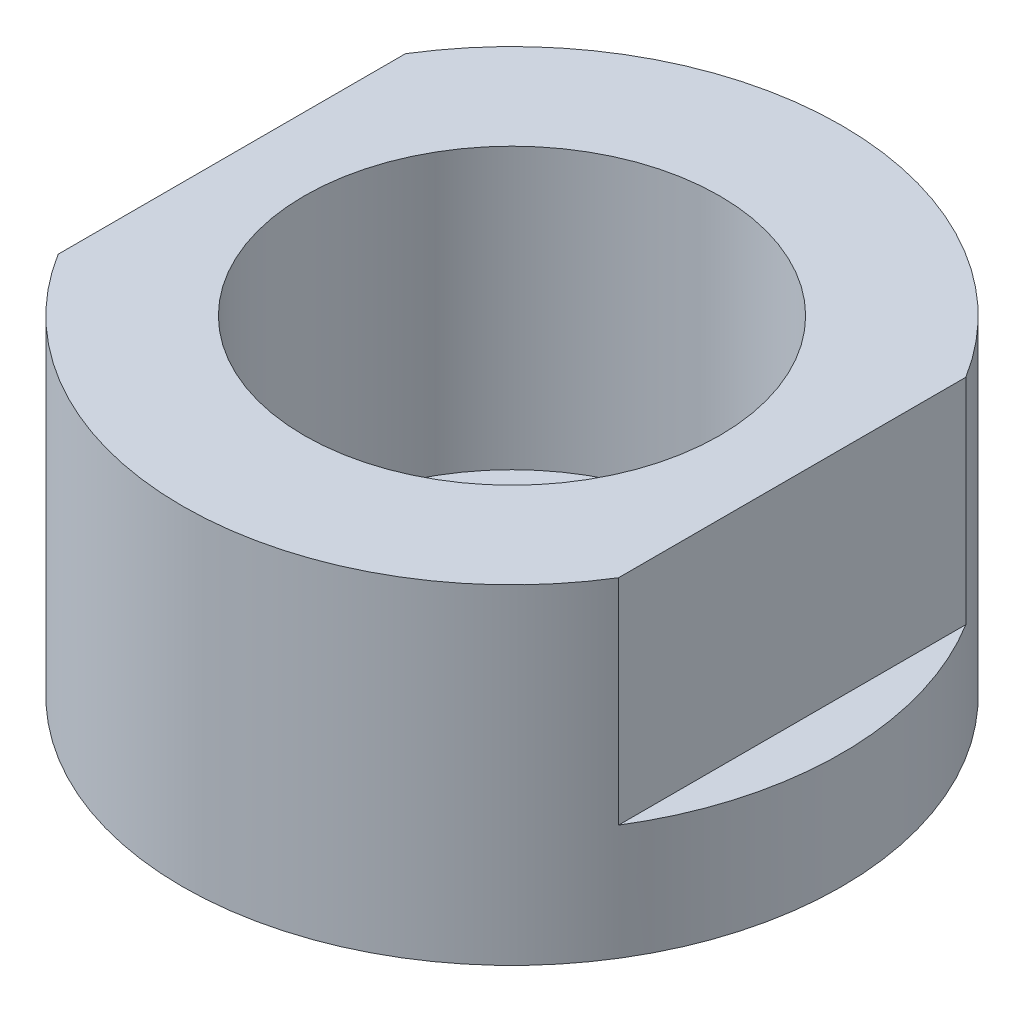
ISO-10303-21;
HEADER;
FILE_DESCRIPTION(('STEP AP214'),'2;1');
FILE_NAME('part.step','',(''),(''),'','','');
FILE_SCHEMA(('AUTOMOTIVE_DESIGN { 1 0 10303 214 1 1 1 1 }'));
ENDSEC;
DATA;
#1=APPLICATION_CONTEXT('core data for automotive mechanical design processes');
#2=APPLICATION_PROTOCOL_DEFINITION('international standard','automotive_design',2000,#1);
#3=PRODUCT_CONTEXT('',#1,'mechanical');
#4=PRODUCT('Part','Part','',(#3));
#5=PRODUCT_RELATED_PRODUCT_CATEGORY('part','',(#4));
#6=PRODUCT_DEFINITION_FORMATION('','',#4);
#7=PRODUCT_DEFINITION_CONTEXT('part definition',#1,'design');
#8=PRODUCT_DEFINITION('design','',#6,#7);
#9=PRODUCT_DEFINITION_SHAPE('','',#8);
#10=(LENGTH_UNIT() NAMED_UNIT(*) SI_UNIT(.MILLI.,.METRE.));
#11=(NAMED_UNIT(*) PLANE_ANGLE_UNIT() SI_UNIT($,.RADIAN.));
#12=(NAMED_UNIT(*) SI_UNIT($,.STERADIAN.) SOLID_ANGLE_UNIT());
#13=UNCERTAINTY_MEASURE_WITH_UNIT(LENGTH_MEASURE(1.E-05),#10,'distance_accuracy_value','');
#14=(GEOMETRIC_REPRESENTATION_CONTEXT(3) GLOBAL_UNCERTAINTY_ASSIGNED_CONTEXT((#13)) GLOBAL_UNIT_ASSIGNED_CONTEXT((#10,
#11,#12)) REPRESENTATION_CONTEXT('',''));
#15=CARTESIAN_POINT('',(0.,0.,0.));
#16=DIRECTION('',(0.,0.,1.));
#17=DIRECTION('',(1.,0.,0.));
#18=AXIS2_PLACEMENT_3D('',#15,#16,#17);
#19=CARTESIAN_POINT('',(0.,25.4,0.));
#20=DIRECTION('',(0.,-1.,0.));
#21=DIRECTION('',(0.,0.,-1.));
#22=AXIS2_PLACEMENT_3D('',#19,#20,#21);
#23=CYLINDRICAL_SURFACE('',#22,25.4);
#24=CARTESIAN_POINT('',(0.,0.,0.));
#25=DIRECTION('',(0.,1.,0.));
#26=DIRECTION('',(0.,0.,1.));
#27=AXIS2_PLACEMENT_3D('',#24,#25,#26);
#28=CIRCLE('',#27,25.4);
#29=CARTESIAN_POINT('',(0.,0.,25.4));
#30=VERTEX_POINT('',#29);
#31=EDGE_CURVE('E48',#30,#30,#28,.T.);
#32=ORIENTED_EDGE('',*,*,#31,.T.);
#33=EDGE_LOOP('',(#32));
#34=FACE_BOUND('',#33,.T.);
#35=DIRECTION('',(0.,-1.,0.));
#36=VECTOR('',#35,1.);
#37=CARTESIAN_POINT('',(21.59,25.4,13.380280266123));
#38=LINE('',#37,#36);
#39=CARTESIAN_POINT('',(21.59,8.89,13.380280266123));
#40=VERTEX_POINT('',#39);
#41=CARTESIAN_POINT('',(21.59,25.4,13.380280266123));
#42=VERTEX_POINT('',#41);
#43=EDGE_CURVE('E96',#40,#42,#38,.F.);
#44=ORIENTED_EDGE('',*,*,#43,.T.);
#45=CARTESIAN_POINT('',(0.,25.4,0.));
#46=DIRECTION('',(0.,1.,0.));
#47=DIRECTION('',(0.,0.,1.));
#48=AXIS2_PLACEMENT_3D('',#45,#46,#47);
#49=CIRCLE('',#48,25.4);
#50=CARTESIAN_POINT('',(-21.59,25.4,13.380280266123));
#51=VERTEX_POINT('',#50);
#52=EDGE_CURVE('E53',#51,#42,#49,.T.);
#53=ORIENTED_EDGE('',*,*,#52,.F.);
#54=DIRECTION('',(0.,-1.,0.));
#55=VECTOR('',#54,1.);
#56=CARTESIAN_POINT('',(-21.59,25.4,13.380280266123));
#57=LINE('',#56,#55);
#58=CARTESIAN_POINT('',(-21.59,8.89,13.380280266123));
#59=VERTEX_POINT('',#58);
#60=EDGE_CURVE('E62',#51,#59,#57,.T.);
#61=ORIENTED_EDGE('',*,*,#60,.T.);
#62=CARTESIAN_POINT('',(0.,8.89,0.));
#63=DIRECTION('',(0.,1.,0.));
#64=DIRECTION('',(0.,0.,1.));
#65=AXIS2_PLACEMENT_3D('',#62,#63,#64);
#66=CIRCLE('',#65,25.4);
#67=CARTESIAN_POINT('',(-21.59,8.89,-13.380280266123));
#68=VERTEX_POINT('',#67);
#69=EDGE_CURVE('E120',#59,#68,#66,.F.);
#70=ORIENTED_EDGE('',*,*,#69,.T.);
#71=DIRECTION('',(0.,-1.,0.));
#72=VECTOR('',#71,1.);
#73=CARTESIAN_POINT('',(-21.59,25.4,-13.380280266123));
#74=LINE('',#73,#72);
#75=CARTESIAN_POINT('',(-21.59,25.4,-13.380280266123));
#76=VERTEX_POINT('',#75);
#77=EDGE_CURVE('E117',#76,#68,#74,.T.);
#78=ORIENTED_EDGE('',*,*,#77,.F.);
#79=CARTESIAN_POINT('',(21.59,25.4,-13.380280266123));
#80=VERTEX_POINT('',#79);
#81=EDGE_CURVE('E12',#80,#76,#49,.T.);
#82=ORIENTED_EDGE('',*,*,#81,.F.);
#83=DIRECTION('',(0.,-1.,0.));
#84=VECTOR('',#83,1.);
#85=CARTESIAN_POINT('',(21.59,25.4,-13.380280266123));
#86=LINE('',#85,#84);
#87=CARTESIAN_POINT('',(21.59,8.89,-13.380280266123));
#88=VERTEX_POINT('',#87);
#89=EDGE_CURVE('E70',#88,#80,#86,.F.);
#90=ORIENTED_EDGE('',*,*,#89,.F.);
#91=CARTESIAN_POINT('',(0.,8.89,0.));
#92=DIRECTION('',(0.,1.,0.));
#93=DIRECTION('',(0.,0.,1.));
#94=AXIS2_PLACEMENT_3D('',#91,#92,#93);
#95=CIRCLE('',#94,25.4);
#96=EDGE_CURVE('E89',#88,#40,#95,.F.);
#97=ORIENTED_EDGE('',*,*,#96,.T.);
#98=EDGE_LOOP('',(#44,#53,#61,#70,#78,#82,#90,#97));
#99=FACE_BOUND('',#98,.T.);
#100=ADVANCED_FACE('F45',(#34,#99),#23,.T.);
#101=CARTESIAN_POINT('',(0.,25.4,0.));
#102=DIRECTION('',(0.,1.,0.));
#103=DIRECTION('',(0.,0.,1.));
#104=AXIS2_PLACEMENT_3D('',#101,#102,#103);
#105=PLANE('',#104);
#106=CARTESIAN_POINT('',(0.,25.4,0.));
#107=DIRECTION('',(0.,1.,0.));
#108=DIRECTION('',(0.,0.,1.));
#109=AXIS2_PLACEMENT_3D('',#106,#107,#108);
#110=CIRCLE('',#109,16.);
#111=CARTESIAN_POINT('',(0.,25.4,16.));
#112=VERTEX_POINT('',#111);
#113=EDGE_CURVE('E116',#112,#112,#110,.T.);
#114=ORIENTED_EDGE('',*,*,#113,.F.);
#115=EDGE_LOOP('',(#114));
#116=FACE_BOUND('',#115,.T.);
#117=ORIENTED_EDGE('',*,*,#52,.T.);
#118=DIRECTION('',(0.,0.,-1.));
#119=VECTOR('',#118,1.);
#120=CARTESIAN_POINT('',(21.59,25.4,25.401));
#121=LINE('',#120,#119);
#122=EDGE_CURVE('E100',#42,#80,#121,.T.);
#123=ORIENTED_EDGE('',*,*,#122,.T.);
#124=ORIENTED_EDGE('',*,*,#81,.T.);
#125=DIRECTION('',(0.,0.,-1.));
#126=VECTOR('',#125,1.);
#127=CARTESIAN_POINT('',(-21.59,25.4,25.401));
#128=LINE('',#127,#126);
#129=EDGE_CURVE('E107',#51,#76,#128,.T.);
#130=ORIENTED_EDGE('',*,*,#129,.F.);
#131=EDGE_LOOP('',(#117,#123,#124,#130));
#132=FACE_BOUND('',#131,.T.);
#133=ADVANCED_FACE('F148',(#116,#132),#105,.T.);
#134=CARTESIAN_POINT('',(0.,0.,0.));
#135=DIRECTION('',(0.,1.,0.));
#136=DIRECTION('',(0.,0.,1.));
#137=AXIS2_PLACEMENT_3D('',#134,#135,#136);
#138=PLANE('',#137);
#139=CARTESIAN_POINT('',(0.,0.,-8.89));
#140=DIRECTION('',(0.,1.,0.));
#141=DIRECTION('',(0.,0.,1.));
#142=AXIS2_PLACEMENT_3D('',#139,#140,#141);
#143=CIRCLE('',#142,1.);
#144=CARTESIAN_POINT('',(0.,0.,-7.89));
#145=VERTEX_POINT('',#144);
#146=EDGE_CURVE('E121',#145,#145,#143,.F.);
#147=ORIENTED_EDGE('',*,*,#146,.F.);
#148=EDGE_LOOP('',(#147));
#149=FACE_BOUND('',#148,.T.);
#150=CARTESIAN_POINT('',(7.6989658396442,0.,4.44499999999969));
#151=DIRECTION('',(0.,1.,0.));
#152=DIRECTION('',(0.,0.,1.));
#153=AXIS2_PLACEMENT_3D('',#150,#151,#152);
#154=CIRCLE('',#153,1.);
#155=CARTESIAN_POINT('',(7.6989658396442,0.,5.44499999999969));
#156=VERTEX_POINT('',#155);
#157=EDGE_CURVE('E260',#156,#156,#154,.F.);
#158=ORIENTED_EDGE('',*,*,#157,.F.);
#159=EDGE_LOOP('',(#158));
#160=FACE_BOUND('',#159,.T.);
#161=CARTESIAN_POINT('',(-7.69896583964312,0.,4.44500000000031));
#162=DIRECTION('',(0.,1.,0.));
#163=DIRECTION('',(0.,0.,1.));
#164=AXIS2_PLACEMENT_3D('',#161,#162,#163);
#165=CIRCLE('',#164,1.);
#166=CARTESIAN_POINT('',(-7.69896583964312,0.,5.44500000000031));
#167=VERTEX_POINT('',#166);
#168=EDGE_CURVE('E110',#167,#167,#165,.F.);
#169=ORIENTED_EDGE('',*,*,#168,.F.);
#170=EDGE_LOOP('',(#169));
#171=FACE_BOUND('',#170,.T.);
#172=ORIENTED_EDGE('',*,*,#31,.F.);
#173=EDGE_LOOP('',(#172));
#174=FACE_BOUND('',#173,.T.);
#175=ADVANCED_FACE('F145',(#149,#160,#171,#174),#138,.F.);
#176=CARTESIAN_POINT('',(0.,-45.254833995939,0.));
#177=DIRECTION('',(0.,1.,0.));
#178=DIRECTION('',(0.,0.,1.));
#179=AXIS2_PLACEMENT_3D('',#176,#177,#178);
#180=CYLINDRICAL_SURFACE('',#179,16.);
#181=CARTESIAN_POINT('',(0.,3.81,0.));
#182=DIRECTION('',(0.,1.,0.));
#183=DIRECTION('',(0.,0.,1.));
#184=AXIS2_PLACEMENT_3D('',#181,#182,#183);
#185=CIRCLE('',#184,16.);
#186=CARTESIAN_POINT('',(0.,3.80999999999999,16.));
#187=VERTEX_POINT('',#186);
#188=EDGE_CURVE('E132',#187,#187,#185,.F.);
#189=CARTESIAN_POINT('',(0.,3.80999999999999,16.));
#190=CARTESIAN_POINT('',(0.,4.03489583333333,16.));
#191=CARTESIAN_POINT('',(0.,4.25979166666666,16.));
#192=CARTESIAN_POINT('',(0.,4.70958333333333,16.));
#193=CARTESIAN_POINT('',(0.,4.93447916666666,16.));
#194=CARTESIAN_POINT('',(0.,5.38427083333333,16.));
#195=CARTESIAN_POINT('',(0.,5.60916666666666,16.));
#196=CARTESIAN_POINT('',(0.,6.05895833333333,16.));
#197=CARTESIAN_POINT('',(0.,6.28385416666666,16.));
#198=CARTESIAN_POINT('',(0.,6.73364583333333,16.));
#199=CARTESIAN_POINT('',(0.,6.95854166666666,16.));
#200=CARTESIAN_POINT('',(0.,7.40833333333333,16.));
#201=CARTESIAN_POINT('',(0.,7.63322916666666,16.));
#202=CARTESIAN_POINT('',(0.,8.08302083333333,16.));
#203=CARTESIAN_POINT('',(0.,8.30791666666667,16.));
#204=CARTESIAN_POINT('',(0.,8.75770833333333,16.));
#205=CARTESIAN_POINT('',(0.,8.98260416666666,16.));
#206=CARTESIAN_POINT('',(0.,9.43239583333333,16.));
#207=CARTESIAN_POINT('',(0.,9.65729166666666,16.));
#208=CARTESIAN_POINT('',(0.,10.1070833333333,16.));
#209=CARTESIAN_POINT('',(0.,10.3319791666667,16.));
#210=CARTESIAN_POINT('',(0.,10.7817708333333,16.));
#211=CARTESIAN_POINT('',(0.,11.0066666666667,16.));
#212=CARTESIAN_POINT('',(0.,11.4564583333333,16.));
#213=CARTESIAN_POINT('',(0.,11.6813541666667,16.));
#214=CARTESIAN_POINT('',(0.,12.1311458333333,16.));
#215=CARTESIAN_POINT('',(0.,12.3560416666667,16.));
#216=CARTESIAN_POINT('',(0.,12.8058333333333,16.));
#217=CARTESIAN_POINT('',(0.,13.0307291666667,16.));
#218=CARTESIAN_POINT('',(0.,13.4805208333333,16.));
#219=CARTESIAN_POINT('',(0.,13.7054166666667,16.));
#220=CARTESIAN_POINT('',(0.,14.1552083333333,16.));
#221=CARTESIAN_POINT('',(0.,14.3801041666667,16.));
#222=CARTESIAN_POINT('',(0.,14.8298958333333,16.));
#223=CARTESIAN_POINT('',(0.,15.0547916666667,16.));
#224=CARTESIAN_POINT('',(0.,15.5045833333333,16.));
#225=CARTESIAN_POINT('',(0.,15.7294791666667,16.));
#226=CARTESIAN_POINT('',(0.,16.1792708333333,16.));
#227=CARTESIAN_POINT('',(0.,16.4041666666667,16.));
#228=CARTESIAN_POINT('',(0.,16.8539583333333,16.));
#229=CARTESIAN_POINT('',(0.,17.0788541666667,16.));
#230=CARTESIAN_POINT('',(0.,17.5286458333333,16.));
#231=CARTESIAN_POINT('',(0.,17.7535416666667,16.));
#232=CARTESIAN_POINT('',(0.,18.2033333333333,16.));
#233=CARTESIAN_POINT('',(0.,18.4282291666667,16.));
#234=CARTESIAN_POINT('',(0.,18.8780208333333,16.));
#235=CARTESIAN_POINT('',(0.,19.1029166666667,16.));
#236=CARTESIAN_POINT('',(0.,19.5527083333333,16.));
#237=CARTESIAN_POINT('',(0.,19.7776041666667,16.));
#238=CARTESIAN_POINT('',(0.,20.2273958333333,16.));
#239=CARTESIAN_POINT('',(0.,20.4522916666667,16.));
#240=CARTESIAN_POINT('',(0.,20.9020833333333,16.));
#241=CARTESIAN_POINT('',(0.,21.1269791666667,16.));
#242=CARTESIAN_POINT('',(0.,21.5767708333333,16.));
#243=CARTESIAN_POINT('',(0.,21.8016666666667,16.));
#244=CARTESIAN_POINT('',(0.,22.2514583333333,16.));
#245=CARTESIAN_POINT('',(0.,22.4763541666667,16.));
#246=CARTESIAN_POINT('',(0.,22.9261458333333,16.));
#247=CARTESIAN_POINT('',(0.,23.1510416666667,16.));
#248=CARTESIAN_POINT('',(0.,23.6008333333333,16.));
#249=CARTESIAN_POINT('',(0.,23.8257291666667,16.));
#250=CARTESIAN_POINT('',(0.,24.2755208333333,16.));
#251=CARTESIAN_POINT('',(0.,24.5004166666667,16.));
#252=CARTESIAN_POINT('',(0.,24.9502083333333,16.));
#253=CARTESIAN_POINT('',(0.,25.1751041666667,16.));
#254=CARTESIAN_POINT('',(0.,25.4,16.));
#255=B_SPLINE_CURVE_WITH_KNOTS('',3,(#189,#190,#191,#192,#193,#194,#195,#196,#197,#198,#199,
#200,#201,#202,#203,#204,#205,#206,#207,#208,#209,#210,#211,#212,#213,#214,#215,#216,#217,#218,
#219,#220,#221,#222,#223,#224,#225,#226,#227,#228,#229,#230,#231,#232,#233,#234,#235,#236,#237,
#238,#239,#240,#241,#242,#243,#244,#245,#246,#247,#248,#249,#250,#251,#252,#253,#254),
.UNSPECIFIED.,.F.,.F.,(4,2,2,2,2,2,2,2,2,2,2,2,2,2,2,2,2,2,2,2,2,2,2,2,2,2,2,2,2,2,2,2,4),(0.,
0.6746875,1.349375,2.0240625,2.69875,3.3734375,4.048125,4.72281250000001,5.3975,
6.07218750000001,6.74687500000001,7.42156250000001,8.09625000000001,8.77093750000001,
9.44562500000001,10.1203125,10.795,11.4696875,12.144375,12.8190625,13.49375,14.1684375,
14.843125,15.5178125,16.1925,16.8671875,17.541875,18.2165625,18.89125,19.5659375,20.240625,
20.9153125,21.59),.UNSPECIFIED.);
#256=EDGE_CURVE('BSEAM147',#187,#112,#255,.T.);
#257=ORIENTED_EDGE('',*,*,#188,.T.);
#258=ORIENTED_EDGE('',*,*,#113,.T.);
#259=ORIENTED_EDGE('',*,*,#256,.T.);
#260=ORIENTED_EDGE('',*,*,#256,.F.);
#261=EDGE_LOOP('',(#257,#259,#258,#260));
#262=FACE_BOUND('',#261,.T.);
#263=ADVANCED_FACE('F147',(#262),#180,.F.);
#264=CARTESIAN_POINT('',(0.,3.81,0.));
#265=DIRECTION('',(0.,1.,0.));
#266=DIRECTION('',(0.,0.,1.));
#267=AXIS2_PLACEMENT_3D('',#264,#265,#266);
#268=PLANE('',#267);
#269=CARTESIAN_POINT('',(0.,3.81,-8.89));
#270=DIRECTION('',(0.,1.,0.));
#271=DIRECTION('',(0.,0.,1.));
#272=AXIS2_PLACEMENT_3D('',#269,#270,#271);
#273=CIRCLE('',#272,1.);
#274=CARTESIAN_POINT('',(0.,3.81,-7.89));
#275=VERTEX_POINT('',#274);
#276=EDGE_CURVE('E254',#275,#275,#273,.T.);
#277=ORIENTED_EDGE('',*,*,#276,.F.);
#278=EDGE_LOOP('',(#277));
#279=FACE_BOUND('',#278,.T.);
#280=CARTESIAN_POINT('',(7.6989658396442,3.81,4.44499999999969));
#281=DIRECTION('',(0.,1.,0.));
#282=DIRECTION('',(0.,0.,1.));
#283=AXIS2_PLACEMENT_3D('',#280,#281,#282);
#284=CIRCLE('',#283,1.);
#285=CARTESIAN_POINT('',(7.6989658396442,3.81,5.44499999999969));
#286=VERTEX_POINT('',#285);
#287=EDGE_CURVE('E263',#286,#286,#284,.T.);
#288=ORIENTED_EDGE('',*,*,#287,.F.);
#289=EDGE_LOOP('',(#288));
#290=FACE_BOUND('',#289,.T.);
#291=CARTESIAN_POINT('',(-7.69896583964312,3.81,4.44500000000031));
#292=DIRECTION('',(0.,1.,0.));
#293=DIRECTION('',(0.,0.,1.));
#294=AXIS2_PLACEMENT_3D('',#291,#292,#293);
#295=CIRCLE('',#294,1.);
#296=CARTESIAN_POINT('',(-7.69896583964312,3.81,5.44500000000031));
#297=VERTEX_POINT('',#296);
#298=EDGE_CURVE('E267',#297,#297,#295,.T.);
#299=ORIENTED_EDGE('',*,*,#298,.F.);
#300=EDGE_LOOP('',(#299));
#301=FACE_BOUND('',#300,.T.);
#302=ORIENTED_EDGE('',*,*,#188,.F.);
#303=EDGE_LOOP('',(#302));
#304=FACE_BOUND('',#303,.T.);
#305=ADVANCED_FACE('F153',(#279,#290,#301,#304),#268,.T.);
#306=CARTESIAN_POINT('',(-25.4,8.89,25.401));
#307=DIRECTION('',(0.,1.,0.));
#308=DIRECTION('',(0.,0.,1.));
#309=AXIS2_PLACEMENT_3D('',#306,#307,#308);
#310=PLANE('',#309);
#311=DIRECTION('',(0.,0.,-1.));
#312=VECTOR('',#311,1.);
#313=CARTESIAN_POINT('',(-21.59,8.89,25.401));
#314=LINE('',#313,#312);
#315=EDGE_CURVE('E104',#59,#68,#314,.T.);
#316=ORIENTED_EDGE('',*,*,#315,.T.);
#317=ORIENTED_EDGE('',*,*,#69,.F.);
#318=EDGE_LOOP('',(#316,#317));
#319=FACE_BOUND('',#318,.T.);
#320=ADVANCED_FACE('F179',(#319),#310,.T.);
#321=CARTESIAN_POINT('',(-21.59,25.4,25.401));
#322=DIRECTION('',(-1.,0.,0.));
#323=DIRECTION('',(0.,-1.,0.));
#324=AXIS2_PLACEMENT_3D('',#321,#322,#323);
#325=PLANE('',#324);
#326=ORIENTED_EDGE('',*,*,#129,.T.);
#327=ORIENTED_EDGE('',*,*,#77,.T.);
#328=ORIENTED_EDGE('',*,*,#315,.F.);
#329=ORIENTED_EDGE('',*,*,#60,.F.);
#330=EDGE_LOOP('',(#326,#327,#328,#329));
#331=FACE_BOUND('',#330,.T.);
#332=ADVANCED_FACE('F183',(#331),#325,.T.);
#333=CARTESIAN_POINT('',(21.59,25.4,25.401));
#334=DIRECTION('',(1.,0.,0.));
#335=DIRECTION('',(0.,1.,0.));
#336=AXIS2_PLACEMENT_3D('',#333,#334,#335);
#337=PLANE('',#336);
#338=DIRECTION('',(0.,0.,-1.));
#339=VECTOR('',#338,1.);
#340=CARTESIAN_POINT('',(21.59,8.89,25.401));
#341=LINE('',#340,#339);
#342=EDGE_CURVE('E91',#40,#88,#341,.T.);
#343=ORIENTED_EDGE('',*,*,#342,.T.);
#344=ORIENTED_EDGE('',*,*,#89,.T.);
#345=ORIENTED_EDGE('',*,*,#122,.F.);
#346=ORIENTED_EDGE('',*,*,#43,.F.);
#347=EDGE_LOOP('',(#343,#344,#345,#346));
#348=FACE_BOUND('',#347,.T.);
#349=ADVANCED_FACE('F98',(#348),#337,.T.);
#350=CARTESIAN_POINT('',(25.4,8.89,25.401));
#351=DIRECTION('',(0.,1.,0.));
#352=DIRECTION('',(0.,0.,1.));
#353=AXIS2_PLACEMENT_3D('',#350,#351,#352);
#354=PLANE('',#353);
#355=ORIENTED_EDGE('',*,*,#342,.F.);
#356=ORIENTED_EDGE('',*,*,#96,.F.);
#357=EDGE_LOOP('',(#355,#356));
#358=FACE_BOUND('',#357,.T.);
#359=ADVANCED_FACE('F90',(#358),#354,.T.);
#360=CARTESIAN_POINT('',(-7.69896583964312,-0.00100000000000013,4.44500000000031));
#361=DIRECTION('',(0.,1.,0.));
#362=DIRECTION('',(0.,0.,1.));
#363=AXIS2_PLACEMENT_3D('',#360,#361,#362);
#364=CYLINDRICAL_SURFACE('',#363,1.);
#365=ORIENTED_EDGE('',*,*,#298,.T.);
#366=EDGE_LOOP('',(#365));
#367=FACE_BOUND('',#366,.T.);
#368=ORIENTED_EDGE('',*,*,#168,.T.);
#369=EDGE_LOOP('',(#368));
#370=FACE_BOUND('',#369,.T.);
#371=ADVANCED_FACE('F207',(#367,#370),#364,.F.);
#372=CARTESIAN_POINT('',(7.6989658396442,-0.00100000000000013,4.44499999999969));
#373=DIRECTION('',(0.,1.,0.));
#374=DIRECTION('',(0.,0.,1.));
#375=AXIS2_PLACEMENT_3D('',#372,#373,#374);
#376=CYLINDRICAL_SURFACE('',#375,1.);
#377=ORIENTED_EDGE('',*,*,#287,.T.);
#378=EDGE_LOOP('',(#377));
#379=FACE_BOUND('',#378,.T.);
#380=ORIENTED_EDGE('',*,*,#157,.T.);
#381=EDGE_LOOP('',(#380));
#382=FACE_BOUND('',#381,.T.);
#383=ADVANCED_FACE('F227',(#379,#382),#376,.F.);
#384=CARTESIAN_POINT('',(0.,-0.00100000000000013,-8.89));
#385=DIRECTION('',(0.,1.,0.));
#386=DIRECTION('',(0.,0.,1.));
#387=AXIS2_PLACEMENT_3D('',#384,#385,#386);
#388=CYLINDRICAL_SURFACE('',#387,1.);
#389=ORIENTED_EDGE('',*,*,#276,.T.);
#390=EDGE_LOOP('',(#389));
#391=FACE_BOUND('',#390,.T.);
#392=ORIENTED_EDGE('',*,*,#146,.T.);
#393=EDGE_LOOP('',(#392));
#394=FACE_BOUND('',#393,.T.);
#395=ADVANCED_FACE('F237',(#391,#394),#388,.F.);
#396=CLOSED_SHELL('',(#100,#133,#175,#263,#305,#320,#332,#349,#359,#371,#383,#395));
#397=MANIFOLD_SOLID_BREP('B2',#396);
#398=ADVANCED_BREP_SHAPE_REPRESENTATION('',(#18,#397),#14);
#399=SHAPE_DEFINITION_REPRESENTATION(#9,#398);
ENDSEC;
END-ISO-10303-21;
